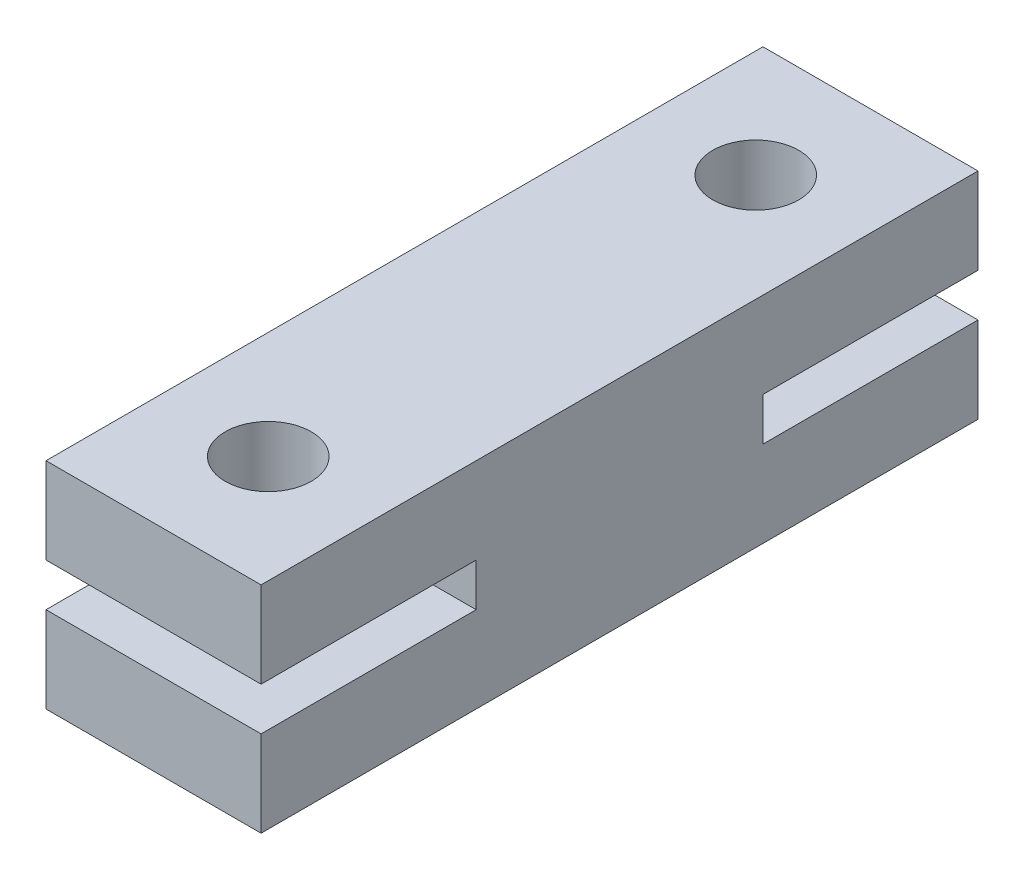
ISO-10303-21;
HEADER;
FILE_DESCRIPTION(('STEP AP214'),'2;1');
FILE_NAME('part.step','',(''),(''),'','','');
FILE_SCHEMA(('AUTOMOTIVE_DESIGN { 1 0 10303 214 1 1 1 1 }'));
ENDSEC;
DATA;
#1=APPLICATION_CONTEXT('core data for automotive mechanical design processes');
#2=APPLICATION_PROTOCOL_DEFINITION('international standard','automotive_design',2000,#1);
#3=PRODUCT_CONTEXT('',#1,'mechanical');
#4=PRODUCT('Part','Part','',(#3));
#5=PRODUCT_RELATED_PRODUCT_CATEGORY('part','',(#4));
#6=PRODUCT_DEFINITION_FORMATION('','',#4);
#7=PRODUCT_DEFINITION_CONTEXT('part definition',#1,'design');
#8=PRODUCT_DEFINITION('design','',#6,#7);
#9=PRODUCT_DEFINITION_SHAPE('','',#8);
#10=(LENGTH_UNIT() NAMED_UNIT(*) SI_UNIT(.MILLI.,.METRE.));
#11=(NAMED_UNIT(*) PLANE_ANGLE_UNIT() SI_UNIT($,.RADIAN.));
#12=(NAMED_UNIT(*) SI_UNIT($,.STERADIAN.) SOLID_ANGLE_UNIT());
#13=UNCERTAINTY_MEASURE_WITH_UNIT(LENGTH_MEASURE(1.E-05),#10,'distance_accuracy_value','');
#14=(GEOMETRIC_REPRESENTATION_CONTEXT(3) GLOBAL_UNCERTAINTY_ASSIGNED_CONTEXT((#13)) GLOBAL_UNIT_ASSIGNED_CONTEXT((#10,
#11,#12)) REPRESENTATION_CONTEXT('',''));
#15=CARTESIAN_POINT('',(0.,0.,0.));
#16=DIRECTION('',(0.,0.,1.));
#17=DIRECTION('',(1.,0.,0.));
#18=AXIS2_PLACEMENT_3D('',#15,#16,#17);
#19=CARTESIAN_POINT('',(7.5,7.5,-25.));
#20=DIRECTION('',(0.,0.,1.));
#21=DIRECTION('',(0.,-1.,0.));
#22=AXIS2_PLACEMENT_3D('',#19,#20,#21);
#23=PLANE('',#22);
#24=DIRECTION('',(0.,1.,0.));
#25=VECTOR('',#24,1.);
#26=CARTESIAN_POINT('',(-7.5,7.5,-25.));
#27=LINE('',#26,#25);
#28=CARTESIAN_POINT('',(-7.5,-7.5,-25.));
#29=VERTEX_POINT('',#28);
#30=CARTESIAN_POINT('',(-7.5,-1.5,-25.));
#31=VERTEX_POINT('',#30);
#32=EDGE_CURVE('E231',#29,#31,#27,.T.);
#33=ORIENTED_EDGE('',*,*,#32,.T.);
#34=DIRECTION('',(-1.,0.,0.));
#35=VECTOR('',#34,1.);
#36=CARTESIAN_POINT('',(7.5,-1.5,-25.));
#37=LINE('',#36,#35);
#38=CARTESIAN_POINT('',(7.5,-1.5,-25.));
#39=VERTEX_POINT('',#38);
#40=EDGE_CURVE('E149',#39,#31,#37,.T.);
#41=ORIENTED_EDGE('',*,*,#40,.F.);
#42=DIRECTION('',(0.,1.,0.));
#43=VECTOR('',#42,1.);
#44=CARTESIAN_POINT('',(7.5,7.5,-25.));
#45=LINE('',#44,#43);
#46=CARTESIAN_POINT('',(7.5,-7.5,-25.));
#47=VERTEX_POINT('',#46);
#48=EDGE_CURVE('E214',#47,#39,#45,.T.);
#49=ORIENTED_EDGE('',*,*,#48,.F.);
#50=DIRECTION('',(-1.,0.,0.));
#51=VECTOR('',#50,1.);
#52=CARTESIAN_POINT('',(7.5,-7.5,-25.));
#53=LINE('',#52,#51);
#54=EDGE_CURVE('E230',#47,#29,#53,.T.);
#55=ORIENTED_EDGE('',*,*,#54,.T.);
#56=EDGE_LOOP('',(#33,#41,#49,#55));
#57=FACE_BOUND('',#56,.T.);
#58=ADVANCED_FACE('F39',(#57),#23,.F.);
#59=CARTESIAN_POINT('',(0.,-7.5,-17.));
#60=DIRECTION('',(0.,1.,0.));
#61=DIRECTION('',(0.,0.,1.));
#62=AXIS2_PLACEMENT_3D('',#59,#60,#61);
#63=CYLINDRICAL_SURFACE('',#62,3.);
#64=CARTESIAN_POINT('',(0.,-1.5,-17.));
#65=DIRECTION('',(0.,-1.,0.));
#66=DIRECTION('',(0.,0.,-1.));
#67=AXIS2_PLACEMENT_3D('',#64,#65,#66);
#68=CIRCLE('',#67,3.);
#69=CARTESIAN_POINT('',(0.,-1.5,-20.));
#70=VERTEX_POINT('',#69);
#71=EDGE_CURVE('E43',#70,#70,#68,.F.);
#72=ORIENTED_EDGE('',*,*,#71,.T.);
#73=EDGE_LOOP('',(#72));
#74=FACE_BOUND('',#73,.T.);
#75=CARTESIAN_POINT('',(0.,-7.5,-17.));
#76=DIRECTION('',(0.,1.,0.));
#77=DIRECTION('',(0.,0.,1.));
#78=AXIS2_PLACEMENT_3D('',#75,#76,#77);
#79=CIRCLE('',#78,3.);
#80=CARTESIAN_POINT('',(0.,-7.5,-14.));
#81=VERTEX_POINT('',#80);
#82=EDGE_CURVE('E197',#81,#81,#79,.T.);
#83=ORIENTED_EDGE('',*,*,#82,.F.);
#84=EDGE_LOOP('',(#83));
#85=FACE_BOUND('',#84,.T.);
#86=ADVANCED_FACE('F349',(#74,#85),#63,.F.);
#87=CARTESIAN_POINT('',(7.5,7.5,25.));
#88=DIRECTION('',(0.,0.,-1.));
#89=DIRECTION('',(0.,1.,0.));
#90=AXIS2_PLACEMENT_3D('',#87,#88,#89);
#91=PLANE('',#90);
#92=DIRECTION('',(0.,-1.,0.));
#93=VECTOR('',#92,1.);
#94=CARTESIAN_POINT('',(7.5,7.5,25.));
#95=LINE('',#94,#93);
#96=CARTESIAN_POINT('',(7.5,-1.5,25.));
#97=VERTEX_POINT('',#96);
#98=CARTESIAN_POINT('',(7.5,-7.5,25.));
#99=VERTEX_POINT('',#98);
#100=EDGE_CURVE('E222',#97,#99,#95,.T.);
#101=ORIENTED_EDGE('',*,*,#100,.F.);
#102=DIRECTION('',(1.,0.,0.));
#103=VECTOR('',#102,1.);
#104=CARTESIAN_POINT('',(-7.5,-1.5,25.));
#105=LINE('',#104,#103);
#106=CARTESIAN_POINT('',(-7.5,-1.5,25.));
#107=VERTEX_POINT('',#106);
#108=EDGE_CURVE('E167',#107,#97,#105,.T.);
#109=ORIENTED_EDGE('',*,*,#108,.F.);
#110=DIRECTION('',(0.,-1.,0.));
#111=VECTOR('',#110,1.);
#112=CARTESIAN_POINT('',(-7.5,7.5,25.));
#113=LINE('',#112,#111);
#114=CARTESIAN_POINT('',(-7.5,-7.5,25.));
#115=VERTEX_POINT('',#114);
#116=EDGE_CURVE('E238',#107,#115,#113,.T.);
#117=ORIENTED_EDGE('',*,*,#116,.T.);
#118=DIRECTION('',(-1.,0.,0.));
#119=VECTOR('',#118,1.);
#120=CARTESIAN_POINT('',(7.5,-7.5,25.));
#121=LINE('',#120,#119);
#122=EDGE_CURVE('E249',#99,#115,#121,.T.);
#123=ORIENTED_EDGE('',*,*,#122,.F.);
#124=EDGE_LOOP('',(#101,#109,#117,#123));
#125=FACE_BOUND('',#124,.T.);
#126=ADVANCED_FACE('F299',(#125),#91,.F.);
#127=CARTESIAN_POINT('',(0.,-7.5,17.));
#128=DIRECTION('',(0.,1.,0.));
#129=DIRECTION('',(0.,0.,1.));
#130=AXIS2_PLACEMENT_3D('',#127,#128,#129);
#131=CYLINDRICAL_SURFACE('',#130,3.);
#132=CARTESIAN_POINT('',(0.,-1.5,17.));
#133=DIRECTION('',(0.,-1.,0.));
#134=DIRECTION('',(0.,0.,-1.));
#135=AXIS2_PLACEMENT_3D('',#132,#133,#134);
#136=CIRCLE('',#135,3.);
#137=CARTESIAN_POINT('',(0.,-1.5,14.));
#138=VERTEX_POINT('',#137);
#139=EDGE_CURVE('E213',#138,#138,#136,.F.);
#140=ORIENTED_EDGE('',*,*,#139,.T.);
#141=EDGE_LOOP('',(#140));
#142=FACE_BOUND('',#141,.T.);
#143=CARTESIAN_POINT('',(0.,-7.5,17.));
#144=DIRECTION('',(0.,1.,0.));
#145=DIRECTION('',(0.,0.,1.));
#146=AXIS2_PLACEMENT_3D('',#143,#144,#145);
#147=CIRCLE('',#146,3.);
#148=CARTESIAN_POINT('',(0.,-7.5,20.));
#149=VERTEX_POINT('',#148);
#150=EDGE_CURVE('E209',#149,#149,#147,.T.);
#151=ORIENTED_EDGE('',*,*,#150,.F.);
#152=EDGE_LOOP('',(#151));
#153=FACE_BOUND('',#152,.T.);
#154=ADVANCED_FACE('F337',(#142,#153),#131,.F.);
#155=CARTESIAN_POINT('',(7.5,1.5,-25.));
#156=VERTEX_POINT('',#155);
#157=CARTESIAN_POINT('',(7.5,7.5,-25.));
#158=VERTEX_POINT('',#157);
#159=EDGE_CURVE('E219',#156,#158,#45,.T.);
#160=ORIENTED_EDGE('',*,*,#159,.F.);
#161=DIRECTION('',(1.,0.,0.));
#162=VECTOR('',#161,1.);
#163=CARTESIAN_POINT('',(7.5,1.5,-25.));
#164=LINE('',#163,#162);
#165=CARTESIAN_POINT('',(-7.5,1.5,-25.));
#166=VERTEX_POINT('',#165);
#167=EDGE_CURVE('E276',#166,#156,#164,.T.);
#168=ORIENTED_EDGE('',*,*,#167,.F.);
#169=CARTESIAN_POINT('',(-7.5,7.5,-25.));
#170=VERTEX_POINT('',#169);
#171=EDGE_CURVE('E154',#166,#170,#27,.T.);
#172=ORIENTED_EDGE('',*,*,#171,.T.);
#173=DIRECTION('',(-1.,0.,0.));
#174=VECTOR('',#173,1.);
#175=CARTESIAN_POINT('',(7.5,7.5,-25.));
#176=LINE('',#175,#174);
#177=EDGE_CURVE('E11',#158,#170,#176,.T.);
#178=ORIENTED_EDGE('',*,*,#177,.F.);
#179=EDGE_LOOP('',(#160,#168,#172,#178));
#180=FACE_BOUND('',#179,.T.);
#181=ADVANCED_FACE('F41',(#180),#23,.F.);
#182=CARTESIAN_POINT('',(7.5,7.5,25.));
#183=DIRECTION('',(0.,-1.,0.));
#184=DIRECTION('',(0.,0.,-1.));
#185=AXIS2_PLACEMENT_3D('',#182,#183,#184);
#186=PLANE('',#185);
#187=CARTESIAN_POINT('',(0.,7.5,-17.));
#188=DIRECTION('',(0.,1.,0.));
#189=DIRECTION('',(0.,0.,1.));
#190=AXIS2_PLACEMENT_3D('',#187,#188,#189);
#191=CIRCLE('',#190,3.);
#192=CARTESIAN_POINT('',(0.,7.5,-14.));
#193=VERTEX_POINT('',#192);
#194=EDGE_CURVE('E201',#193,#193,#191,.T.);
#195=ORIENTED_EDGE('',*,*,#194,.F.);
#196=EDGE_LOOP('',(#195));
#197=FACE_BOUND('',#196,.T.);
#198=CARTESIAN_POINT('',(0.,7.5,17.));
#199=DIRECTION('',(0.,1.,0.));
#200=DIRECTION('',(0.,0.,1.));
#201=AXIS2_PLACEMENT_3D('',#198,#199,#200);
#202=CIRCLE('',#201,3.);
#203=CARTESIAN_POINT('',(0.,7.5,20.));
#204=VERTEX_POINT('',#203);
#205=EDGE_CURVE('E205',#204,#204,#202,.T.);
#206=ORIENTED_EDGE('',*,*,#205,.F.);
#207=EDGE_LOOP('',(#206));
#208=FACE_BOUND('',#207,.T.);
#209=DIRECTION('',(0.,0.,1.));
#210=VECTOR('',#209,1.);
#211=CARTESIAN_POINT('',(-7.5,7.5,25.));
#212=LINE('',#211,#210);
#213=CARTESIAN_POINT('',(-7.5,7.5,25.));
#214=VERTEX_POINT('',#213);
#215=EDGE_CURVE('E235',#170,#214,#212,.T.);
#216=ORIENTED_EDGE('',*,*,#215,.T.);
#217=DIRECTION('',(-1.,0.,0.));
#218=VECTOR('',#217,1.);
#219=CARTESIAN_POINT('',(7.5,7.5,25.));
#220=LINE('',#219,#218);
#221=CARTESIAN_POINT('',(7.5,7.5,25.));
#222=VERTEX_POINT('',#221);
#223=EDGE_CURVE('E49',#222,#214,#220,.T.);
#224=ORIENTED_EDGE('',*,*,#223,.F.);
#225=DIRECTION('',(0.,0.,1.));
#226=VECTOR('',#225,1.);
#227=CARTESIAN_POINT('',(7.5,7.5,25.));
#228=LINE('',#227,#226);
#229=EDGE_CURVE('E218',#158,#222,#228,.T.);
#230=ORIENTED_EDGE('',*,*,#229,.F.);
#231=ORIENTED_EDGE('',*,*,#177,.T.);
#232=EDGE_LOOP('',(#216,#224,#230,#231));
#233=FACE_BOUND('',#232,.T.);
#234=ADVANCED_FACE('F310',(#197,#208,#233),#186,.F.);
#235=CARTESIAN_POINT('',(-7.5,1.5,25.));
#236=VERTEX_POINT('',#235);
#237=EDGE_CURVE('E239',#214,#236,#113,.T.);
#238=ORIENTED_EDGE('',*,*,#237,.T.);
#239=DIRECTION('',(-1.,0.,0.));
#240=VECTOR('',#239,1.);
#241=CARTESIAN_POINT('',(-7.5,1.5,25.));
#242=LINE('',#241,#240);
#243=CARTESIAN_POINT('',(7.5,1.5,25.));
#244=VERTEX_POINT('',#243);
#245=EDGE_CURVE('E178',#244,#236,#242,.T.);
#246=ORIENTED_EDGE('',*,*,#245,.F.);
#247=EDGE_CURVE('E223',#222,#244,#95,.T.);
#248=ORIENTED_EDGE('',*,*,#247,.F.);
#249=ORIENTED_EDGE('',*,*,#223,.T.);
#250=EDGE_LOOP('',(#238,#246,#248,#249));
#251=FACE_BOUND('',#250,.T.);
#252=ADVANCED_FACE('F325',(#251),#91,.F.);
#253=CARTESIAN_POINT('',(7.5,-7.5,25.));
#254=DIRECTION('',(0.,1.,0.));
#255=DIRECTION('',(0.,0.,1.));
#256=AXIS2_PLACEMENT_3D('',#253,#254,#255);
#257=PLANE('',#256);
#258=ORIENTED_EDGE('',*,*,#82,.T.);
#259=EDGE_LOOP('',(#258));
#260=FACE_BOUND('',#259,.T.);
#261=ORIENTED_EDGE('',*,*,#150,.T.);
#262=EDGE_LOOP('',(#261));
#263=FACE_BOUND('',#262,.T.);
#264=DIRECTION('',(0.,0.,-1.));
#265=VECTOR('',#264,1.);
#266=CARTESIAN_POINT('',(-7.5,-7.5,25.));
#267=LINE('',#266,#265);
#268=EDGE_CURVE('E243',#115,#29,#267,.T.);
#269=ORIENTED_EDGE('',*,*,#268,.T.);
#270=ORIENTED_EDGE('',*,*,#54,.F.);
#271=DIRECTION('',(0.,0.,-1.));
#272=VECTOR('',#271,1.);
#273=CARTESIAN_POINT('',(7.5,-7.5,25.));
#274=LINE('',#273,#272);
#275=EDGE_CURVE('E227',#99,#47,#274,.T.);
#276=ORIENTED_EDGE('',*,*,#275,.F.);
#277=ORIENTED_EDGE('',*,*,#122,.T.);
#278=EDGE_LOOP('',(#269,#270,#276,#277));
#279=FACE_BOUND('',#278,.T.);
#280=ADVANCED_FACE('F295',(#260,#263,#279),#257,.F.);
#281=CARTESIAN_POINT('',(7.5,0.,0.));
#282=DIRECTION('',(1.,0.,0.));
#283=DIRECTION('',(0.,0.,-1.));
#284=AXIS2_PLACEMENT_3D('',#281,#282,#283);
#285=PLANE('',#284);
#286=DIRECTION('',(0.,0.,-1.));
#287=VECTOR('',#286,1.);
#288=CARTESIAN_POINT('',(7.5,-1.50000000000001,-10.));
#289=LINE('',#288,#287);
#290=CARTESIAN_POINT('',(7.5,-1.50000000000001,-10.));
#291=VERTEX_POINT('',#290);
#292=EDGE_CURVE('E159',#291,#39,#289,.T.);
#293=ORIENTED_EDGE('',*,*,#292,.F.);
#294=DIRECTION('',(0.,-1.,0.));
#295=VECTOR('',#294,1.);
#296=CARTESIAN_POINT('',(7.5,-1.50000000000001,-10.));
#297=LINE('',#296,#295);
#298=CARTESIAN_POINT('',(7.5,1.49999999999999,-10.));
#299=VERTEX_POINT('',#298);
#300=EDGE_CURVE('E141',#299,#291,#297,.T.);
#301=ORIENTED_EDGE('',*,*,#300,.F.);
#302=DIRECTION('',(0.,0.,-1.));
#303=VECTOR('',#302,1.);
#304=CARTESIAN_POINT('',(7.5,1.49999999999999,-10.));
#305=LINE('',#304,#303);
#306=EDGE_CURVE('E138',#299,#156,#305,.T.);
#307=ORIENTED_EDGE('',*,*,#306,.T.);
#308=ORIENTED_EDGE('',*,*,#159,.T.);
#309=ORIENTED_EDGE('',*,*,#229,.T.);
#310=ORIENTED_EDGE('',*,*,#247,.T.);
#311=DIRECTION('',(0.,0.,1.));
#312=VECTOR('',#311,1.);
#313=CARTESIAN_POINT('',(7.5,1.5,10.));
#314=LINE('',#313,#312);
#315=CARTESIAN_POINT('',(7.5,1.5,10.));
#316=VERTEX_POINT('',#315);
#317=EDGE_CURVE('E177',#316,#244,#314,.T.);
#318=ORIENTED_EDGE('',*,*,#317,.F.);
#319=DIRECTION('',(0.,1.,0.));
#320=VECTOR('',#319,1.);
#321=CARTESIAN_POINT('',(7.5,1.5,10.));
#322=LINE('',#321,#320);
#323=CARTESIAN_POINT('',(7.5,-1.5,10.));
#324=VERTEX_POINT('',#323);
#325=EDGE_CURVE('E164',#324,#316,#322,.T.);
#326=ORIENTED_EDGE('',*,*,#325,.F.);
#327=DIRECTION('',(0.,0.,1.));
#328=VECTOR('',#327,1.);
#329=CARTESIAN_POINT('',(7.5,-1.5,10.));
#330=LINE('',#329,#328);
#331=EDGE_CURVE('E183',#324,#97,#330,.T.);
#332=ORIENTED_EDGE('',*,*,#331,.T.);
#333=ORIENTED_EDGE('',*,*,#100,.T.);
#334=ORIENTED_EDGE('',*,*,#275,.T.);
#335=ORIENTED_EDGE('',*,*,#48,.T.);
#336=EDGE_LOOP('',(#293,#301,#307,#308,#309,#310,#318,#326,#332,#333,#334,#335));
#337=FACE_BOUND('',#336,.T.);
#338=ADVANCED_FACE('F286',(#337),#285,.T.);
#339=CARTESIAN_POINT('',(-7.5,0.,0.));
#340=DIRECTION('',(1.,0.,0.));
#341=DIRECTION('',(0.,0.,-1.));
#342=AXIS2_PLACEMENT_3D('',#339,#340,#341);
#343=PLANE('',#342);
#344=DIRECTION('',(0.,1.,0.));
#345=VECTOR('',#344,1.);
#346=CARTESIAN_POINT('',(-7.5,-1.50000000000001,-10.));
#347=LINE('',#346,#345);
#348=CARTESIAN_POINT('',(-7.5,-1.50000000000001,-10.));
#349=VERTEX_POINT('',#348);
#350=CARTESIAN_POINT('',(-7.5,1.49999999999999,-10.));
#351=VERTEX_POINT('',#350);
#352=EDGE_CURVE('E142',#349,#351,#347,.T.);
#353=ORIENTED_EDGE('',*,*,#352,.F.);
#354=DIRECTION('',(0.,0.,-1.));
#355=VECTOR('',#354,1.);
#356=CARTESIAN_POINT('',(-7.5,-1.50000000000001,-10.));
#357=LINE('',#356,#355);
#358=EDGE_CURVE('E264',#349,#31,#357,.T.);
#359=ORIENTED_EDGE('',*,*,#358,.T.);
#360=ORIENTED_EDGE('',*,*,#32,.F.);
#361=ORIENTED_EDGE('',*,*,#268,.F.);
#362=ORIENTED_EDGE('',*,*,#116,.F.);
#363=DIRECTION('',(0.,0.,1.));
#364=VECTOR('',#363,1.);
#365=CARTESIAN_POINT('',(-7.5,-1.5,10.));
#366=LINE('',#365,#364);
#367=CARTESIAN_POINT('',(-7.5,-1.5,10.));
#368=VERTEX_POINT('',#367);
#369=EDGE_CURVE('E188',#368,#107,#366,.T.);
#370=ORIENTED_EDGE('',*,*,#369,.F.);
#371=DIRECTION('',(0.,-1.,0.));
#372=VECTOR('',#371,1.);
#373=CARTESIAN_POINT('',(-7.5,1.5,10.));
#374=LINE('',#373,#372);
#375=CARTESIAN_POINT('',(-7.5,1.5,10.));
#376=VERTEX_POINT('',#375);
#377=EDGE_CURVE('E170',#376,#368,#374,.T.);
#378=ORIENTED_EDGE('',*,*,#377,.F.);
#379=DIRECTION('',(0.,0.,1.));
#380=VECTOR('',#379,1.);
#381=CARTESIAN_POINT('',(-7.5,1.5,10.));
#382=LINE('',#381,#380);
#383=EDGE_CURVE('E191',#376,#236,#382,.T.);
#384=ORIENTED_EDGE('',*,*,#383,.T.);
#385=ORIENTED_EDGE('',*,*,#237,.F.);
#386=ORIENTED_EDGE('',*,*,#215,.F.);
#387=ORIENTED_EDGE('',*,*,#171,.F.);
#388=DIRECTION('',(0.,0.,-1.));
#389=VECTOR('',#388,1.);
#390=CARTESIAN_POINT('',(-7.5,1.49999999999999,-10.));
#391=LINE('',#390,#389);
#392=EDGE_CURVE('E135',#351,#166,#391,.T.);
#393=ORIENTED_EDGE('',*,*,#392,.F.);
#394=EDGE_LOOP('',(#353,#359,#360,#361,#362,#370,#378,#384,#385,#386,#387,#393));
#395=FACE_BOUND('',#394,.T.);
#396=ADVANCED_FACE('F152',(#395),#343,.F.);
#397=CARTESIAN_POINT('',(0.,1.5,17.));
#398=DIRECTION('',(0.,1.,0.));
#399=DIRECTION('',(0.,0.,1.));
#400=AXIS2_PLACEMENT_3D('',#397,#398,#399);
#401=CIRCLE('',#400,3.);
#402=CARTESIAN_POINT('',(0.,1.5,20.));
#403=VERTEX_POINT('',#402);
#404=EDGE_CURVE('E187',#403,#403,#401,.F.);
#405=ORIENTED_EDGE('',*,*,#404,.T.);
#406=EDGE_LOOP('',(#405));
#407=FACE_BOUND('',#406,.T.);
#408=ORIENTED_EDGE('',*,*,#205,.T.);
#409=EDGE_LOOP('',(#408));
#410=FACE_BOUND('',#409,.T.);
#411=ADVANCED_FACE('F332',(#407,#410),#131,.F.);
#412=CARTESIAN_POINT('',(0.,1.5,-17.));
#413=DIRECTION('',(0.,1.,0.));
#414=DIRECTION('',(0.,0.,1.));
#415=AXIS2_PLACEMENT_3D('',#412,#413,#414);
#416=CIRCLE('',#415,3.);
#417=CARTESIAN_POINT('',(0.,1.49999999999999,-14.));
#418=VERTEX_POINT('',#417);
#419=EDGE_CURVE('E261',#418,#418,#416,.F.);
#420=ORIENTED_EDGE('',*,*,#419,.T.);
#421=EDGE_LOOP('',(#420));
#422=FACE_BOUND('',#421,.T.);
#423=ORIENTED_EDGE('',*,*,#194,.T.);
#424=EDGE_LOOP('',(#423));
#425=FACE_BOUND('',#424,.T.);
#426=ADVANCED_FACE('F335',(#422,#425),#63,.F.);
#427=CARTESIAN_POINT('',(-7.5,-1.5,10.));
#428=DIRECTION('',(0.,-1.,0.));
#429=DIRECTION('',(0.,0.,-1.));
#430=AXIS2_PLACEMENT_3D('',#427,#428,#429);
#431=PLANE('',#430);
#432=ORIENTED_EDGE('',*,*,#108,.T.);
#433=ORIENTED_EDGE('',*,*,#331,.F.);
#434=DIRECTION('',(1.,0.,0.));
#435=VECTOR('',#434,1.);
#436=CARTESIAN_POINT('',(-7.5,-1.5,10.));
#437=LINE('',#436,#435);
#438=EDGE_CURVE('E173',#368,#324,#437,.T.);
#439=ORIENTED_EDGE('',*,*,#438,.F.);
#440=ORIENTED_EDGE('',*,*,#369,.T.);
#441=EDGE_LOOP('',(#432,#433,#439,#440));
#442=FACE_BOUND('',#441,.T.);
#443=ORIENTED_EDGE('',*,*,#139,.F.);
#444=EDGE_LOOP('',(#443));
#445=FACE_BOUND('',#444,.T.);
#446=ADVANCED_FACE('F318',(#442,#445),#431,.F.);
#447=CARTESIAN_POINT('',(-7.5,1.5,10.));
#448=DIRECTION('',(0.,1.,0.));
#449=DIRECTION('',(0.,0.,1.));
#450=AXIS2_PLACEMENT_3D('',#447,#448,#449);
#451=PLANE('',#450);
#452=ORIENTED_EDGE('',*,*,#245,.T.);
#453=ORIENTED_EDGE('',*,*,#383,.F.);
#454=DIRECTION('',(-1.,0.,0.));
#455=VECTOR('',#454,1.);
#456=CARTESIAN_POINT('',(-7.5,1.5,10.));
#457=LINE('',#456,#455);
#458=EDGE_CURVE('E65',#316,#376,#457,.T.);
#459=ORIENTED_EDGE('',*,*,#458,.F.);
#460=ORIENTED_EDGE('',*,*,#317,.T.);
#461=EDGE_LOOP('',(#452,#453,#459,#460));
#462=FACE_BOUND('',#461,.T.);
#463=ORIENTED_EDGE('',*,*,#404,.F.);
#464=EDGE_LOOP('',(#463));
#465=FACE_BOUND('',#464,.T.);
#466=ADVANCED_FACE('F326',(#462,#465),#451,.F.);
#467=CARTESIAN_POINT('',(0.,0.,10.));
#468=DIRECTION('',(0.,0.,1.));
#469=DIRECTION('',(1.,0.,0.));
#470=AXIS2_PLACEMENT_3D('',#467,#468,#469);
#471=PLANE('',#470);
#472=ORIENTED_EDGE('',*,*,#325,.T.);
#473=ORIENTED_EDGE('',*,*,#458,.T.);
#474=ORIENTED_EDGE('',*,*,#377,.T.);
#475=ORIENTED_EDGE('',*,*,#438,.T.);
#476=EDGE_LOOP('',(#472,#473,#474,#475));
#477=FACE_BOUND('',#476,.T.);
#478=ADVANCED_FACE('F320',(#477),#471,.T.);
#479=CARTESIAN_POINT('',(7.5,-1.50000000000001,-10.));
#480=DIRECTION('',(0.,-1.,0.));
#481=DIRECTION('',(0.,0.,-1.));
#482=AXIS2_PLACEMENT_3D('',#479,#480,#481);
#483=PLANE('',#482);
#484=ORIENTED_EDGE('',*,*,#40,.T.);
#485=ORIENTED_EDGE('',*,*,#358,.F.);
#486=DIRECTION('',(-1.,0.,0.));
#487=VECTOR('',#486,1.);
#488=CARTESIAN_POINT('',(7.5,-1.50000000000001,-10.));
#489=LINE('',#488,#487);
#490=EDGE_CURVE('E57',#291,#349,#489,.T.);
#491=ORIENTED_EDGE('',*,*,#490,.F.);
#492=ORIENTED_EDGE('',*,*,#292,.T.);
#493=EDGE_LOOP('',(#484,#485,#491,#492));
#494=FACE_BOUND('',#493,.T.);
#495=ORIENTED_EDGE('',*,*,#71,.F.);
#496=EDGE_LOOP('',(#495));
#497=FACE_BOUND('',#496,.T.);
#498=ADVANCED_FACE('F283',(#494,#497),#483,.F.);
#499=CARTESIAN_POINT('',(7.5,1.49999999999999,-10.));
#500=DIRECTION('',(0.,1.,0.));
#501=DIRECTION('',(0.,0.,1.));
#502=AXIS2_PLACEMENT_3D('',#499,#500,#501);
#503=PLANE('',#502);
#504=ORIENTED_EDGE('',*,*,#167,.T.);
#505=ORIENTED_EDGE('',*,*,#306,.F.);
#506=DIRECTION('',(1.,0.,0.));
#507=VECTOR('',#506,1.);
#508=CARTESIAN_POINT('',(7.5,1.49999999999999,-10.));
#509=LINE('',#508,#507);
#510=EDGE_CURVE('E131',#351,#299,#509,.T.);
#511=ORIENTED_EDGE('',*,*,#510,.F.);
#512=ORIENTED_EDGE('',*,*,#392,.T.);
#513=EDGE_LOOP('',(#504,#505,#511,#512));
#514=FACE_BOUND('',#513,.T.);
#515=ORIENTED_EDGE('',*,*,#419,.F.);
#516=EDGE_LOOP('',(#515));
#517=FACE_BOUND('',#516,.T.);
#518=ADVANCED_FACE('F132',(#514,#517),#503,.F.);
#519=CARTESIAN_POINT('',(0.,0.,-10.));
#520=DIRECTION('',(0.,0.,1.));
#521=DIRECTION('',(1.,0.,0.));
#522=AXIS2_PLACEMENT_3D('',#519,#520,#521);
#523=PLANE('',#522);
#524=ORIENTED_EDGE('',*,*,#352,.T.);
#525=ORIENTED_EDGE('',*,*,#510,.T.);
#526=ORIENTED_EDGE('',*,*,#300,.T.);
#527=ORIENTED_EDGE('',*,*,#490,.T.);
#528=EDGE_LOOP('',(#524,#525,#526,#527));
#529=FACE_BOUND('',#528,.T.);
#530=ADVANCED_FACE('F145',(#529),#523,.F.);
#531=CLOSED_SHELL('',(#58,#86,#126,#154,#181,#234,#252,#280,#338,#396,#411,#426,#446,#466,#478,
#498,#518,#530));
#532=MANIFOLD_SOLID_BREP('B2',#531);
#533=ADVANCED_BREP_SHAPE_REPRESENTATION('',(#18,#532),#14);
#534=SHAPE_DEFINITION_REPRESENTATION(#9,#533);
ENDSEC;
END-ISO-10303-21;
